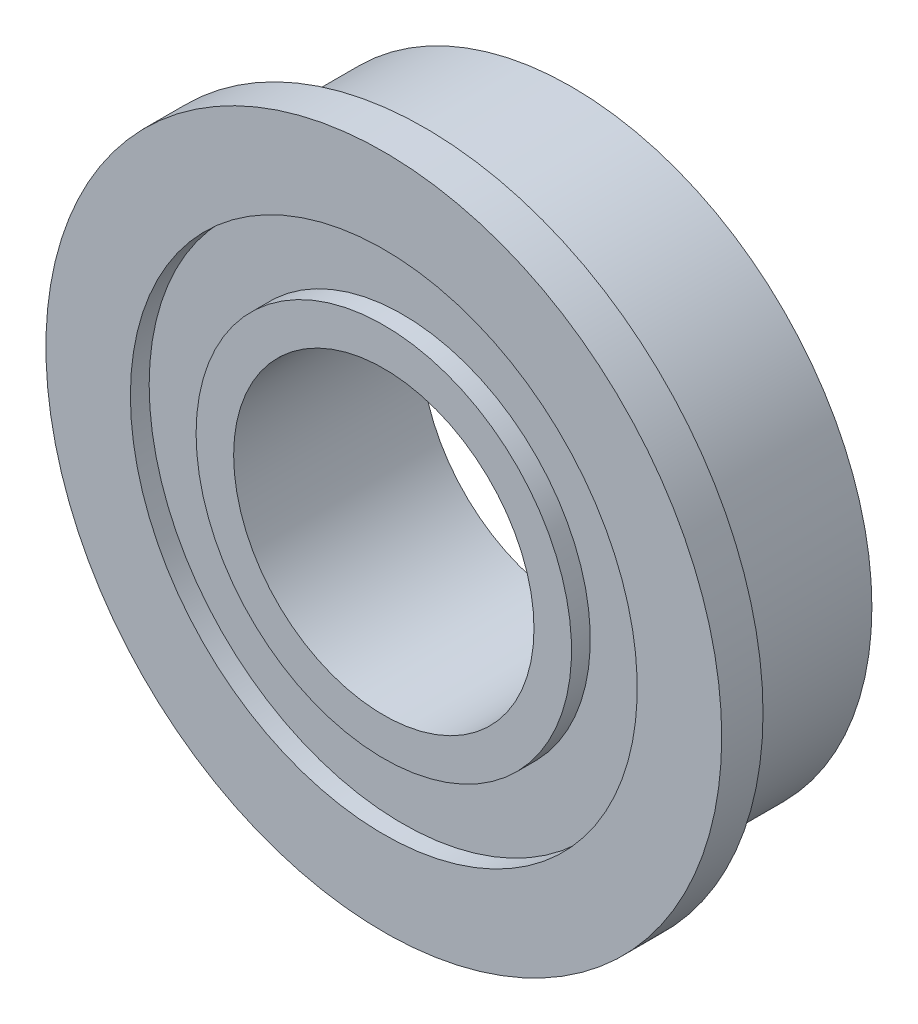
ISO-10303-21;
HEADER;
FILE_DESCRIPTION(('STEP AP214'),'2;1');
FILE_NAME('part.step','',(''),(''),'','','');
FILE_SCHEMA(('AUTOMOTIVE_DESIGN { 1 0 10303 214 1 1 1 1 }'));
ENDSEC;
DATA;
#1=APPLICATION_CONTEXT('core data for automotive mechanical design processes');
#2=APPLICATION_PROTOCOL_DEFINITION('international standard','automotive_design',2000,#1);
#3=PRODUCT_CONTEXT('',#1,'mechanical');
#4=PRODUCT('Part','Part','',(#3));
#5=PRODUCT_RELATED_PRODUCT_CATEGORY('part','',(#4));
#6=PRODUCT_DEFINITION_FORMATION('','',#4);
#7=PRODUCT_DEFINITION_CONTEXT('part definition',#1,'design');
#8=PRODUCT_DEFINITION('design','',#6,#7);
#9=PRODUCT_DEFINITION_SHAPE('','',#8);
#10=(LENGTH_UNIT() NAMED_UNIT(*) SI_UNIT(.MILLI.,.METRE.));
#11=(NAMED_UNIT(*) PLANE_ANGLE_UNIT() SI_UNIT($,.RADIAN.));
#12=(NAMED_UNIT(*) SI_UNIT($,.STERADIAN.) SOLID_ANGLE_UNIT());
#13=UNCERTAINTY_MEASURE_WITH_UNIT(LENGTH_MEASURE(1.E-05),#10,'distance_accuracy_value','');
#14=(GEOMETRIC_REPRESENTATION_CONTEXT(3) GLOBAL_UNCERTAINTY_ASSIGNED_CONTEXT((#13)) GLOBAL_UNIT_ASSIGNED_CONTEXT((#10,
#11,#12)) REPRESENTATION_CONTEXT('',''));
#15=CARTESIAN_POINT('',(0.,0.,0.));
#16=DIRECTION('',(0.,0.,1.));
#17=DIRECTION('',(1.,0.,0.));
#18=AXIS2_PLACEMENT_3D('',#15,#16,#17);
#19=CARTESIAN_POINT('',(0.,0.,5.));
#20=DIRECTION('',(0.,0.,1.));
#21=DIRECTION('',(1.,0.,0.));
#22=AXIS2_PLACEMENT_3D('',#19,#20,#21);
#23=PLANE('',#22);
#24=CARTESIAN_POINT('',(0.,0.,5.));
#25=DIRECTION('',(0.,0.,-1.));
#26=DIRECTION('',(-1.,0.,0.));
#27=AXIS2_PLACEMENT_3D('',#24,#25,#26);
#28=CIRCLE('',#27,4.);
#29=CARTESIAN_POINT('',(-4.,0.,5.));
#30=VERTEX_POINT('',#29);
#31=EDGE_CURVE('E56',#30,#30,#28,.T.);
#32=ORIENTED_EDGE('',*,*,#31,.T.);
#33=EDGE_LOOP('',(#32));
#34=FACE_BOUND('',#33,.T.);
#35=CARTESIAN_POINT('',(0.,0.,5.));
#36=DIRECTION('',(0.,0.,-1.));
#37=DIRECTION('',(-1.,0.,0.));
#38=AXIS2_PLACEMENT_3D('',#35,#36,#37);
#39=CIRCLE('',#38,5.);
#40=CARTESIAN_POINT('',(-5.,0.,5.));
#41=VERTEX_POINT('',#40);
#42=EDGE_CURVE('E71',#41,#41,#39,.T.);
#43=ORIENTED_EDGE('',*,*,#42,.F.);
#44=EDGE_LOOP('',(#43));
#45=FACE_BOUND('',#44,.T.);
#46=ADVANCED_FACE('F30',(#34,#45),#23,.T.);
#47=CARTESIAN_POINT('',(0.,0.,3.9));
#48=DIRECTION('',(0.,0.,-1.));
#49=DIRECTION('',(-1.,0.,0.));
#50=AXIS2_PLACEMENT_3D('',#47,#48,#49);
#51=CYLINDRICAL_SURFACE('',#50,8.);
#52=CARTESIAN_POINT('',(0.,0.,3.9));
#53=DIRECTION('',(0.,0.,1.));
#54=DIRECTION('',(1.,0.,0.));
#55=AXIS2_PLACEMENT_3D('',#52,#53,#54);
#56=CIRCLE('',#55,8.);
#57=CARTESIAN_POINT('',(8.,0.,3.9));
#58=VERTEX_POINT('',#57);
#59=EDGE_CURVE('E10',#58,#58,#56,.T.);
#60=ORIENTED_EDGE('',*,*,#59,.F.);
#61=EDGE_LOOP('',(#60));
#62=FACE_BOUND('',#61,.T.);
#63=CARTESIAN_POINT('',(0.,0.,0.));
#64=DIRECTION('',(0.,0.,1.));
#65=DIRECTION('',(1.,0.,0.));
#66=AXIS2_PLACEMENT_3D('',#63,#64,#65);
#67=CIRCLE('',#66,8.);
#68=CARTESIAN_POINT('',(8.,0.,0.));
#69=VERTEX_POINT('',#68);
#70=EDGE_CURVE('E34',#69,#69,#67,.T.);
#71=ORIENTED_EDGE('',*,*,#70,.T.);
#72=EDGE_LOOP('',(#71));
#73=FACE_BOUND('',#72,.T.);
#74=ADVANCED_FACE('F32',(#62,#73),#51,.T.);
#75=CARTESIAN_POINT('',(0.,0.,0.));
#76=DIRECTION('',(0.,0.,1.));
#77=DIRECTION('',(1.,0.,0.));
#78=AXIS2_PLACEMENT_3D('',#75,#76,#77);
#79=PLANE('',#78);
#80=CARTESIAN_POINT('',(0.,0.,0.));
#81=DIRECTION('',(0.,0.,-1.));
#82=DIRECTION('',(-1.,0.,0.));
#83=AXIS2_PLACEMENT_3D('',#80,#81,#82);
#84=CIRCLE('',#83,6.75);
#85=CARTESIAN_POINT('',(-6.75,0.,0.));
#86=VERTEX_POINT('',#85);
#87=EDGE_CURVE('E49',#86,#86,#84,.T.);
#88=ORIENTED_EDGE('',*,*,#87,.F.);
#89=EDGE_LOOP('',(#88));
#90=FACE_BOUND('',#89,.T.);
#91=ORIENTED_EDGE('',*,*,#70,.F.);
#92=EDGE_LOOP('',(#91));
#93=FACE_BOUND('',#92,.T.);
#94=ADVANCED_FACE('F97',(#90,#93),#79,.F.);
#95=CARTESIAN_POINT('',(0.,0.,5.));
#96=DIRECTION('',(0.,0.,-1.));
#97=DIRECTION('',(-1.,0.,0.));
#98=AXIS2_PLACEMENT_3D('',#95,#96,#97);
#99=CYLINDRICAL_SURFACE('',#98,9.);
#100=CARTESIAN_POINT('',(0.,0.,5.));
#101=DIRECTION('',(0.,0.,1.));
#102=DIRECTION('',(1.,0.,0.));
#103=AXIS2_PLACEMENT_3D('',#100,#101,#102);
#104=CIRCLE('',#103,9.);
#105=CARTESIAN_POINT('',(9.,0.,5.));
#106=VERTEX_POINT('',#105);
#107=EDGE_CURVE('E41',#106,#106,#104,.T.);
#108=ORIENTED_EDGE('',*,*,#107,.F.);
#109=EDGE_LOOP('',(#108));
#110=FACE_BOUND('',#109,.T.);
#111=CARTESIAN_POINT('',(0.,0.,3.9));
#112=DIRECTION('',(0.,0.,1.));
#113=DIRECTION('',(1.,0.,0.));
#114=AXIS2_PLACEMENT_3D('',#111,#112,#113);
#115=CIRCLE('',#114,9.);
#116=CARTESIAN_POINT('',(9.,0.,3.9));
#117=VERTEX_POINT('',#116);
#118=EDGE_CURVE('E43',#117,#117,#115,.T.);
#119=ORIENTED_EDGE('',*,*,#118,.T.);
#120=EDGE_LOOP('',(#119));
#121=FACE_BOUND('',#120,.T.);
#122=ADVANCED_FACE('F103',(#110,#121),#99,.T.);
#123=CARTESIAN_POINT('',(0.,0.,5.));
#124=DIRECTION('',(0.,0.,-1.));
#125=DIRECTION('',(-1.,0.,0.));
#126=AXIS2_PLACEMENT_3D('',#123,#124,#125);
#127=CIRCLE('',#126,6.75);
#128=CARTESIAN_POINT('',(-6.75,0.,5.));
#129=VERTEX_POINT('',#128);
#130=EDGE_CURVE('E67',#129,#129,#127,.T.);
#131=ORIENTED_EDGE('',*,*,#130,.T.);
#132=EDGE_LOOP('',(#131));
#133=FACE_BOUND('',#132,.T.);
#134=ORIENTED_EDGE('',*,*,#107,.T.);
#135=EDGE_LOOP('',(#134));
#136=FACE_BOUND('',#135,.T.);
#137=ADVANCED_FACE('F93',(#133,#136),#23,.T.);
#138=CARTESIAN_POINT('',(0.,0.,3.9));
#139=DIRECTION('',(0.,0.,1.));
#140=DIRECTION('',(1.,0.,0.));
#141=AXIS2_PLACEMENT_3D('',#138,#139,#140);
#142=PLANE('',#141);
#143=ORIENTED_EDGE('',*,*,#59,.T.);
#144=EDGE_LOOP('',(#143));
#145=FACE_BOUND('',#144,.T.);
#146=ORIENTED_EDGE('',*,*,#118,.F.);
#147=EDGE_LOOP('',(#146));
#148=FACE_BOUND('',#147,.T.);
#149=ADVANCED_FACE('F102',(#145,#148),#142,.F.);
#150=CARTESIAN_POINT('',(0.,0.,0.5));
#151=DIRECTION('',(0.,0.,-1.));
#152=DIRECTION('',(-1.,0.,0.));
#153=AXIS2_PLACEMENT_3D('',#150,#151,#152);
#154=CYLINDRICAL_SURFACE('',#153,5.);
#155=CARTESIAN_POINT('',(0.,0.,0.5));
#156=DIRECTION('',(0.,0.,-1.));
#157=DIRECTION('',(-1.,0.,0.));
#158=AXIS2_PLACEMENT_3D('',#155,#156,#157);
#159=CIRCLE('',#158,5.);
#160=CARTESIAN_POINT('',(-5.,0.,0.5));
#161=VERTEX_POINT('',#160);
#162=EDGE_CURVE('E52',#161,#161,#159,.T.);
#163=ORIENTED_EDGE('',*,*,#162,.T.);
#164=EDGE_LOOP('',(#163));
#165=FACE_BOUND('',#164,.T.);
#166=CARTESIAN_POINT('',(0.,0.,0.));
#167=DIRECTION('',(0.,0.,-1.));
#168=DIRECTION('',(-1.,0.,0.));
#169=AXIS2_PLACEMENT_3D('',#166,#167,#168);
#170=CIRCLE('',#169,5.);
#171=CARTESIAN_POINT('',(-5.,0.,0.));
#172=VERTEX_POINT('',#171);
#173=EDGE_CURVE('E53',#172,#172,#170,.T.);
#174=ORIENTED_EDGE('',*,*,#173,.F.);
#175=EDGE_LOOP('',(#174));
#176=FACE_BOUND('',#175,.T.);
#177=ADVANCED_FACE('F109',(#165,#176),#154,.T.);
#178=CARTESIAN_POINT('',(0.,0.,0.5));
#179=DIRECTION('',(0.,0.,-1.));
#180=DIRECTION('',(-1.,0.,0.));
#181=AXIS2_PLACEMENT_3D('',#178,#179,#180);
#182=CYLINDRICAL_SURFACE('',#181,6.75);
#183=CARTESIAN_POINT('',(0.,0.,0.5));
#184=DIRECTION('',(0.,0.,-1.));
#185=DIRECTION('',(-1.,0.,0.));
#186=AXIS2_PLACEMENT_3D('',#183,#184,#185);
#187=CIRCLE('',#186,6.75);
#188=CARTESIAN_POINT('',(-6.75,0.,0.5));
#189=VERTEX_POINT('',#188);
#190=EDGE_CURVE('E46',#189,#189,#187,.T.);
#191=ORIENTED_EDGE('',*,*,#190,.F.);
#192=EDGE_LOOP('',(#191));
#193=FACE_BOUND('',#192,.T.);
#194=ORIENTED_EDGE('',*,*,#87,.T.);
#195=EDGE_LOOP('',(#194));
#196=FACE_BOUND('',#195,.T.);
#197=ADVANCED_FACE('F134',(#193,#196),#182,.F.);
#198=CARTESIAN_POINT('',(0.,0.,0.5));
#199=DIRECTION('',(0.,0.,-1.));
#200=DIRECTION('',(-1.,0.,0.));
#201=AXIS2_PLACEMENT_3D('',#198,#199,#200);
#202=PLANE('',#201);
#203=ORIENTED_EDGE('',*,*,#162,.F.);
#204=EDGE_LOOP('',(#203));
#205=FACE_BOUND('',#204,.T.);
#206=ORIENTED_EDGE('',*,*,#190,.T.);
#207=EDGE_LOOP('',(#206));
#208=FACE_BOUND('',#207,.T.);
#209=ADVANCED_FACE('F131',(#205,#208),#202,.T.);
#210=CARTESIAN_POINT('',(0.,0.,0.));
#211=DIRECTION('',(0.,0.,-1.));
#212=DIRECTION('',(-1.,0.,0.));
#213=AXIS2_PLACEMENT_3D('',#210,#211,#212);
#214=CIRCLE('',#213,4.);
#215=CARTESIAN_POINT('',(-4.,0.,0.));
#216=VERTEX_POINT('',#215);
#217=EDGE_CURVE('E61',#216,#216,#214,.T.);
#218=ORIENTED_EDGE('',*,*,#217,.F.);
#219=EDGE_LOOP('',(#218));
#220=FACE_BOUND('',#219,.T.);
#221=ORIENTED_EDGE('',*,*,#173,.T.);
#222=EDGE_LOOP('',(#221));
#223=FACE_BOUND('',#222,.T.);
#224=ADVANCED_FACE('F129',(#220,#223),#79,.F.);
#225=CARTESIAN_POINT('',(0.,0.,5.));
#226=DIRECTION('',(0.,0.,-1.));
#227=DIRECTION('',(-1.,0.,0.));
#228=AXIS2_PLACEMENT_3D('',#225,#226,#227);
#229=CYLINDRICAL_SURFACE('',#228,4.);
#230=ORIENTED_EDGE('',*,*,#31,.F.);
#231=EDGE_LOOP('',(#230));
#232=FACE_BOUND('',#231,.T.);
#233=ORIENTED_EDGE('',*,*,#217,.T.);
#234=EDGE_LOOP('',(#233));
#235=FACE_BOUND('',#234,.T.);
#236=ADVANCED_FACE('F86',(#232,#235),#229,.F.);
#237=CARTESIAN_POINT('',(0.,0.,4.5));
#238=DIRECTION('',(0.,0.,1.));
#239=DIRECTION('',(1.,0.,0.));
#240=AXIS2_PLACEMENT_3D('',#237,#238,#239);
#241=CYLINDRICAL_SURFACE('',#240,5.);
#242=CARTESIAN_POINT('',(0.,0.,4.5));
#243=DIRECTION('',(0.,0.,-1.));
#244=DIRECTION('',(-1.,0.,0.));
#245=AXIS2_PLACEMENT_3D('',#242,#243,#244);
#246=CIRCLE('',#245,5.);
#247=CARTESIAN_POINT('',(-5.,0.,4.5));
#248=VERTEX_POINT('',#247);
#249=EDGE_CURVE('E70',#248,#248,#246,.T.);
#250=ORIENTED_EDGE('',*,*,#249,.F.);
#251=EDGE_LOOP('',(#250));
#252=FACE_BOUND('',#251,.T.);
#253=ORIENTED_EDGE('',*,*,#42,.T.);
#254=EDGE_LOOP('',(#253));
#255=FACE_BOUND('',#254,.T.);
#256=ADVANCED_FACE('F82',(#252,#255),#241,.T.);
#257=CARTESIAN_POINT('',(0.,0.,4.5));
#258=DIRECTION('',(0.,0.,1.));
#259=DIRECTION('',(1.,0.,0.));
#260=AXIS2_PLACEMENT_3D('',#257,#258,#259);
#261=CYLINDRICAL_SURFACE('',#260,6.75);
#262=CARTESIAN_POINT('',(0.,0.,4.5));
#263=DIRECTION('',(0.,0.,-1.));
#264=DIRECTION('',(-1.,0.,0.));
#265=AXIS2_PLACEMENT_3D('',#262,#263,#264);
#266=CIRCLE('',#265,6.75);
#267=CARTESIAN_POINT('',(-6.75,0.,4.5));
#268=VERTEX_POINT('',#267);
#269=EDGE_CURVE('E64',#268,#268,#266,.T.);
#270=ORIENTED_EDGE('',*,*,#269,.T.);
#271=EDGE_LOOP('',(#270));
#272=FACE_BOUND('',#271,.T.);
#273=ORIENTED_EDGE('',*,*,#130,.F.);
#274=EDGE_LOOP('',(#273));
#275=FACE_BOUND('',#274,.T.);
#276=ADVANCED_FACE('F85',(#272,#275),#261,.F.);
#277=CARTESIAN_POINT('',(0.,0.,4.5));
#278=DIRECTION('',(0.,0.,1.));
#279=DIRECTION('',(-1.,0.,0.));
#280=AXIS2_PLACEMENT_3D('',#277,#278,#279);
#281=PLANE('',#280);
#282=ORIENTED_EDGE('',*,*,#249,.T.);
#283=EDGE_LOOP('',(#282));
#284=FACE_BOUND('',#283,.T.);
#285=ORIENTED_EDGE('',*,*,#269,.F.);
#286=EDGE_LOOP('',(#285));
#287=FACE_BOUND('',#286,.T.);
#288=ADVANCED_FACE('F79',(#284,#287),#281,.T.);
#289=CLOSED_SHELL('',(#46,#74,#94,#122,#137,#149,#177,#197,#209,#224,#236,#256,#276,#288));
#290=MANIFOLD_SOLID_BREP('B2',#289);
#291=ADVANCED_BREP_SHAPE_REPRESENTATION('',(#18,#290),#14);
#292=SHAPE_DEFINITION_REPRESENTATION(#9,#291);
ENDSEC;
END-ISO-10303-21;
